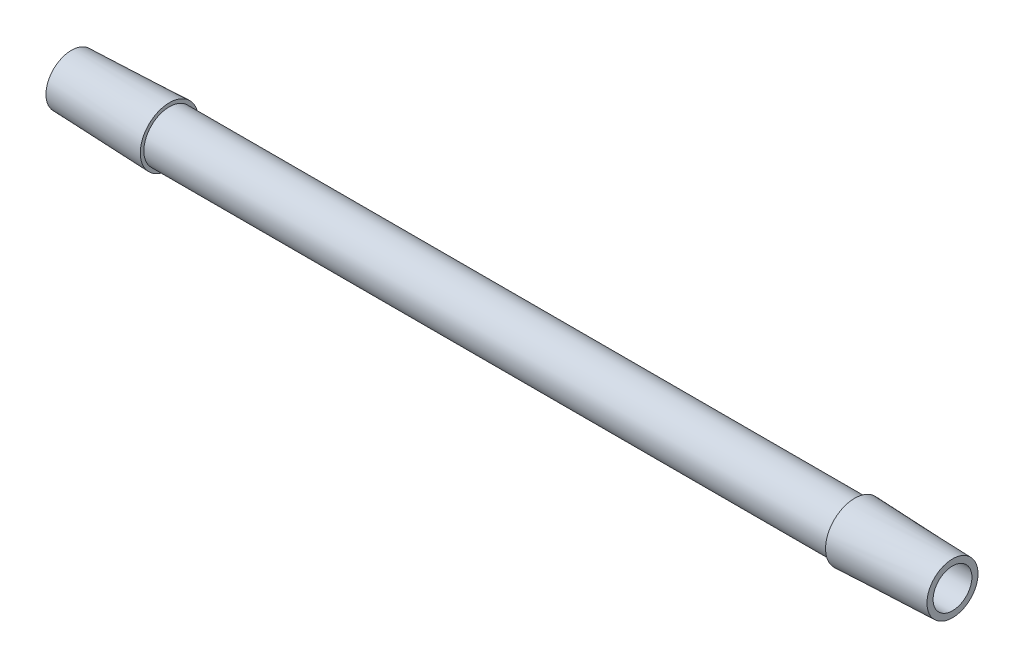
ISO-10303-21;
HEADER;
FILE_DESCRIPTION(('STEP AP214'),'2;1');
FILE_NAME('part.step','',(''),(''),'','','');
FILE_SCHEMA(('AUTOMOTIVE_DESIGN { 1 0 10303 214 1 1 1 1 }'));
ENDSEC;
DATA;
#1=APPLICATION_CONTEXT('core data for automotive mechanical design processes');
#2=APPLICATION_PROTOCOL_DEFINITION('international standard','automotive_design',2000,#1);
#3=PRODUCT_CONTEXT('',#1,'mechanical');
#4=PRODUCT('Part','Part','',(#3));
#5=PRODUCT_RELATED_PRODUCT_CATEGORY('part','',(#4));
#6=PRODUCT_DEFINITION_FORMATION('','',#4);
#7=PRODUCT_DEFINITION_CONTEXT('part definition',#1,'design');
#8=PRODUCT_DEFINITION('design','',#6,#7);
#9=PRODUCT_DEFINITION_SHAPE('','',#8);
#10=(LENGTH_UNIT() NAMED_UNIT(*) SI_UNIT(.MILLI.,.METRE.));
#11=(NAMED_UNIT(*) PLANE_ANGLE_UNIT() SI_UNIT($,.RADIAN.));
#12=(NAMED_UNIT(*) SI_UNIT($,.STERADIAN.) SOLID_ANGLE_UNIT());
#13=UNCERTAINTY_MEASURE_WITH_UNIT(LENGTH_MEASURE(1.E-05),#10,'distance_accuracy_value','');
#14=(GEOMETRIC_REPRESENTATION_CONTEXT(3) GLOBAL_UNCERTAINTY_ASSIGNED_CONTEXT((#13)) GLOBAL_UNIT_ASSIGNED_CONTEXT((#10,
#11,#12)) REPRESENTATION_CONTEXT('',''));
#15=CARTESIAN_POINT('',(0.,0.,0.));
#16=DIRECTION('',(0.,0.,1.));
#17=DIRECTION('',(1.,0.,0.));
#18=AXIS2_PLACEMENT_3D('',#15,#16,#17);
#19=CARTESIAN_POINT('',(72.,0.,0.));
#20=DIRECTION('',(-1.,0.,0.));
#21=DIRECTION('',(0.,0.,1.));
#22=AXIS2_PLACEMENT_3D('',#19,#20,#21);
#23=CYLINDRICAL_SURFACE('',#22,2.085);
#24=CARTESIAN_POINT('',(7.99999999999999,0.,0.));
#25=DIRECTION('',(1.,0.,0.));
#26=DIRECTION('',(0.,0.,-1.));
#27=AXIS2_PLACEMENT_3D('',#24,#25,#26);
#28=CIRCLE('',#27,2.085);
#29=CARTESIAN_POINT('',(7.99999999999999,0.,-2.085));
#30=VERTEX_POINT('',#29);
#31=EDGE_CURVE('E172',#30,#30,#28,.T.);
#32=ORIENTED_EDGE('',*,*,#31,.T.);
#33=EDGE_LOOP('',(#32));
#34=FACE_BOUND('',#33,.T.);
#35=CARTESIAN_POINT('',(64.,0.,0.));
#36=DIRECTION('',(1.,0.,0.));
#37=DIRECTION('',(0.,0.,-1.));
#38=AXIS2_PLACEMENT_3D('',#35,#36,#37);
#39=CIRCLE('',#38,2.085);
#40=CARTESIAN_POINT('',(64.,0.,-2.085));
#41=VERTEX_POINT('',#40);
#42=EDGE_CURVE('E85',#41,#41,#39,.T.);
#43=ORIENTED_EDGE('',*,*,#42,.F.);
#44=EDGE_LOOP('',(#43));
#45=FACE_BOUND('',#44,.T.);
#46=CARTESIAN_POINT('',(36.415,0.,-2.085));
#47=CARTESIAN_POINT('',(36.4149991710071,-0.0385097673049169,-2.08500093848098));
#48=CARTESIAN_POINT('',(36.4145847573027,-0.0770086910896813,-2.08393314795421));
#49=CARTESIAN_POINT('',(36.4129132098612,-0.153919060972507,-2.07966774223883));
#50=CARTESIAN_POINT('',(36.4116550932215,-0.192330352550162,-2.07646764296684));
#51=CARTESIAN_POINT('',(36.407629041223,-0.283221209844286,-2.06635245713016));
#52=CARTESIAN_POINT('',(36.404472110825,-0.33558165602121,-2.05849487817852));
#53=CARTESIAN_POINT('',(36.3963455388832,-0.439419897622538,-2.03885458116174));
#54=CARTESIAN_POINT('',(36.3913757757855,-0.490897633617081,-2.02707159989519));
#55=CARTESIAN_POINT('',(36.3793462743506,-0.592648426975273,-1.99969235312382));
#56=CARTESIAN_POINT('',(36.3722842512539,-0.642920102101451,-1.9840919222012));
#57=CARTESIAN_POINT('',(36.3556552151366,-0.74174179791993,-1.94930500914077));
#58=CARTESIAN_POINT('',(36.3460896404928,-0.790292789077388,-1.93012058793473));
#59=CARTESIAN_POINT('',(36.3212467516915,-0.896259345487727,-1.88361506185062));
#60=CARTESIAN_POINT('',(36.3051599143364,-0.953126203725381,-1.85543839080677));
#61=CARTESIAN_POINT('',(36.2760996691743,-1.03498674205434,-1.81024963404317));
#62=CARTESIAN_POINT('',(36.2655978227798,-1.06168763879829,-1.79470803637047));
#63=CARTESIAN_POINT('',(36.2426095707927,-1.11374784315769,-1.76287266755827));
#64=CARTESIAN_POINT('',(36.2301239268852,-1.13910766072381,-1.74657918680341));
#65=CARTESIAN_POINT('',(36.1981619518951,-1.19651327754359,-1.70796446687377));
#66=CARTESIAN_POINT('',(36.1777478607972,-1.22793129127746,-1.68546272268215));
#67=CARTESIAN_POINT('',(36.1316239803192,-1.28693027549527,-1.64085225379779));
#68=CARTESIAN_POINT('',(36.10592477383,-1.31451873215234,-1.6187428381603));
#69=CARTESIAN_POINT('',(36.0541472281715,-1.35968218319655,-1.58088037723399));
#70=CARTESIAN_POINT('',(36.0291532854659,-1.37815810764345,-1.56473596144591));
#71=CARTESIAN_POINT('',(35.9753787779439,-1.41121864652146,-1.53498617448836));
#72=CARTESIAN_POINT('',(35.9466027235138,-1.42580783434692,-1.52137782493248));
#73=CARTESIAN_POINT('',(35.8859784725503,-1.45080749171398,-1.49755978136518));
#74=CARTESIAN_POINT('',(35.854128638634,-1.46121571867489,-1.48735191180044));
#75=CARTESIAN_POINT('',(35.7884668713754,-1.47805681468094,-1.47061647397089));
#76=CARTESIAN_POINT('',(35.7546523166485,-1.48448423271169,-1.46409395320665));
#77=CARTESIAN_POINT('',(35.6701571684769,-1.49611464717568,-1.45223003661379));
#78=CARTESIAN_POINT('',(35.6189466599822,-1.49935790630689,-1.44884881256993));
#79=CARTESIAN_POINT('',(35.5164149018997,-1.50047253373817,-1.44768657689885));
#80=CARTESIAN_POINT('',(35.4650937839393,-1.49832767639355,-1.44992248055628));
#81=CARTESIAN_POINT('',(35.3636745438276,-1.49012555211944,-1.4583497431017));
#82=CARTESIAN_POINT('',(35.313569294409,-1.48410824094785,-1.46450069966822));
#83=CARTESIAN_POINT('',(35.2142236822196,-1.46904498141503,-1.47960969967835));
#84=CARTESIAN_POINT('',(35.1649842587952,-1.45999593441234,-1.48857061448905));
#85=CARTESIAN_POINT('',(35.0672793869731,-1.43934102336253,-1.5085522073043));
#86=CARTESIAN_POINT('',(35.0188175982459,-1.42772555772792,-1.51958059610212));
#87=CARTESIAN_POINT('',(34.922851261442,-1.40224456913687,-1.54312557433149));
#88=CARTESIAN_POINT('',(34.8753470139677,-1.38837835159512,-1.55564262284584));
#89=CARTESIAN_POINT('',(34.7452090352951,-1.34711493102381,-1.59177008678135));
#90=CARTESIAN_POINT('',(34.6635880147554,-1.31749902015812,-1.61652315274612));
#91=CARTESIAN_POINT('',(34.5034440085413,-1.25190450829697,-1.6678436847954));
#92=CARTESIAN_POINT('',(34.4249243611513,-1.21591926806927,-1.69441302620875));
#93=CARTESIAN_POINT('',(34.2719474924447,-1.13739197251474,-1.74808987582901));
#94=CARTESIAN_POINT('',(34.1974718904573,-1.09488366746099,-1.77519402122993));
#95=CARTESIAN_POINT('',(34.0532461182511,-1.00240753207108,-1.82900763903667));
#96=CARTESIAN_POINT('',(33.9834885906291,-0.952451724418373,-1.85571767266571));
#97=CARTESIAN_POINT('',(33.8665964015209,-0.857014609035718,-1.90126886103836));
#98=CARTESIAN_POINT('',(33.8180830010939,-0.813394969551343,-1.92044517680974));
#99=CARTESIAN_POINT('',(33.7260102557009,-0.720439247161774,-1.95721553520366));
#100=CARTESIAN_POINT('',(33.6824550254764,-0.6710984839048,-1.97480826112178));
#101=CARTESIAN_POINT('',(33.6018091223458,-0.565463444758442,-2.00763008814251));
#102=CARTESIAN_POINT('',(33.5648103125068,-0.509086766507657,-2.02282531702251));
#103=CARTESIAN_POINT('',(33.5011177839023,-0.389914194180464,-2.0491149483013));
#104=CARTESIAN_POINT('',(33.4743893824986,-0.327140826574622,-2.06022314689351));
#105=CARTESIAN_POINT('',(33.441081705179,-0.217582252628833,-2.07409853021049));
#106=CARTESIAN_POINT('',(33.4307901258302,-0.172121393278474,-2.0783979959254));
#107=CARTESIAN_POINT('',(33.4174469850363,-0.0799685156496023,-2.08397520814444));
#108=CARTESIAN_POINT('',(33.4143894120127,-0.0332775522611984,-2.08525546365915));
#109=CARTESIAN_POINT('',(33.415815267174,0.0600025897596786,-2.08465889699805));
#110=CARTESIAN_POINT('',(33.4203047745376,0.106591656041557,-2.08277952974367));
#111=CARTESIAN_POINT('',(33.4363908692695,0.198306773729921,-2.07605888474921));
#112=CARTESIAN_POINT('',(33.4479936416864,0.243431515900241,-2.0712150293661));
#113=CARTESIAN_POINT('',(33.4815433427352,0.343783459453184,-2.0572518238388));
#114=CARTESIAN_POINT('',(33.5054973433689,0.398218634636856,-2.04730682230113));
#115=CARTESIAN_POINT('',(33.5611906696277,0.502201730123208,-2.02431978388004));
#116=CARTESIAN_POINT('',(33.5929444948534,0.551740304493683,-2.01127198045372));
#117=CARTESIAN_POINT('',(33.6818712050029,0.672704739336226,-1.97500785594785));
#118=CARTESIAN_POINT('',(33.7432288535662,0.740552145036615,-1.95022915839704));
#119=CARTESIAN_POINT('',(33.8748820753131,0.865796232613337,-1.89795807225222));
#120=CARTESIAN_POINT('',(33.9452091521725,0.92315425502936,-1.87045619899635));
#121=CARTESIAN_POINT('',(34.0827971246811,1.02236434276414,-1.81789245117699));
#122=CARTESIAN_POINT('',(34.1493655187859,1.06525641654214,-1.79294825458203));
#123=CARTESIAN_POINT('',(34.2861016485374,1.14500484657342,-1.74310111577086));
#124=CARTESIAN_POINT('',(34.3562726833036,1.18185553613449,-1.71819823373037));
#125=CARTESIAN_POINT('',(34.4994118447671,1.24994394338882,-1.66931579699105));
#126=CARTESIAN_POINT('',(34.5723747247574,1.28119161733463,-1.64533466520269));
#127=CARTESIAN_POINT('',(34.7208689653514,1.33833196547614,-1.59919861492766));
#128=CARTESIAN_POINT('',(34.7963981998129,1.36422895238012,-1.57704223440461));
#129=CARTESIAN_POINT('',(34.9368791977315,1.40649249918881,-1.53937085459249));
#130=CARTESIAN_POINT('',(35.0014370350704,1.42373124442249,-1.5233676957969));
#131=CARTESIAN_POINT('',(35.1324616288151,1.45388785526816,-1.494613137929));
#132=CARTESIAN_POINT('',(35.1989317863259,1.46679742995634,-1.48186798933591));
#133=CARTESIAN_POINT('',(35.3003258023161,1.48206242517595,-1.46655059917944));
#134=CARTESIAN_POINT('',(35.3346401004875,1.48648297600255,-1.46206125966427));
#135=CARTESIAN_POINT('',(35.403617085511,1.49362301633155,-1.45476377301681));
#136=CARTESIAN_POINT('',(35.4382799152627,1.49634177656866,-1.45195634665384));
#137=CARTESIAN_POINT('',(35.5423452099914,1.50141185916547,-1.44673448232958));
#138=CARTESIAN_POINT('',(35.6122641496496,1.50075129200625,-1.44744355240469));
#139=CARTESIAN_POINT('',(35.7167932153398,1.49028188106587,-1.45818319559913));
#140=CARTESIAN_POINT('',(35.7523112721166,1.48499508125416,-1.46359787992569));
#141=CARTESIAN_POINT('',(35.8216365010886,1.47031431244713,-1.47834813795108));
#142=CARTESIAN_POINT('',(35.8554466719931,1.46092784266351,-1.48767655134341));
#143=CARTESIAN_POINT('',(35.9203256717508,1.43759051311101,-1.51023793952854));
#144=CARTESIAN_POINT('',(35.9513775033534,1.42361355239399,-1.52349319861261));
#145=CARTESIAN_POINT('',(36.0095132226783,1.39129406189359,-1.55306252445684));
#146=CARTESIAN_POINT('',(36.0365926197697,1.37294665206625,-1.56938000614254));
#147=CARTESIAN_POINT('',(36.0920953509387,1.32799229461299,-1.6077038258507));
#148=CARTESIAN_POINT('',(36.119440375998,1.30045580064034,-1.63016257899447));
#149=CARTESIAN_POINT('',(36.168430387288,1.24117096202827,-1.67574628701054));
#150=CARTESIAN_POINT('',(36.1900604880058,1.20941193592427,-1.69887281094326));
#151=CARTESIAN_POINT('',(36.2250937714186,1.14901713609304,-1.74013384350132));
#152=CARTESIAN_POINT('',(36.2392789848743,1.12090665362698,-1.75839366619925));
#153=CARTESIAN_POINT('',(36.2651668781824,1.06299525204628,-1.79399601770889));
#154=CARTESIAN_POINT('',(36.2768680396299,1.03319331303279,-1.81133798063502));
#155=CARTESIAN_POINT('',(36.2982487487642,0.972154363877724,-1.84481856708735));
#156=CARTESIAN_POINT('',(36.3079246691908,0.940914899071994,-1.86095499880374));
#157=CARTESIAN_POINT('',(36.3255830771722,0.877266986983832,-1.89179261192408));
#158=CARTESIAN_POINT('',(36.3335651121842,0.844858230009237,-1.90649340921536));
#159=CARTESIAN_POINT('',(36.351129472017,0.76537815735329,-1.94009702905434));
#160=CARTESIAN_POINT('',(36.359998074977,0.717811120375887,-1.95820685364457));
#161=CARTESIAN_POINT('',(36.3754364693814,0.621134576577435,-1.99098602880657));
#162=CARTESIAN_POINT('',(36.3820053637145,0.57202447593355,-2.00565403599891));
#163=CARTESIAN_POINT('',(36.3931947009519,0.472738819803948,-2.03134604671662));
#164=CARTESIAN_POINT('',(36.3978186652223,0.422565364142382,-2.04237662803967));
#165=CARTESIAN_POINT('',(36.4053707400758,0.321417044296914,-2.06071856669598));
#166=CARTESIAN_POINT('',(36.4082985116002,0.270442021975023,-2.06802918039506));
#167=CARTESIAN_POINT('',(36.4135082741292,0.146466314565211,-2.08113357249138));
#168=CARTESIAN_POINT('',(36.4150015760552,0.0732135606448902,-2.08499821578943));
#169=CARTESIAN_POINT('',(36.415,0.,-2.085));
#170=B_SPLINE_CURVE_WITH_KNOTS('',3,(#46,#47,#48,#49,#50,#51,#52,#53,#54,#55,#56,#57,#58,#59,
#60,#61,#62,#63,#64,#65,#66,#67,#68,#69,#70,#71,#72,#73,#74,#75,#76,#77,#78,#79,#80,#81,#82,#83,
#84,#85,#86,#87,#88,#89,#90,#91,#92,#93,#94,#95,#96,#97,#98,#99,#100,#101,#102,#103,#104,#105,
#106,#107,#108,#109,#110,#111,#112,#113,#114,#115,#116,#117,#118,#119,#120,#121,#122,#123,#124,
#125,#126,#127,#128,#129,#130,#131,#132,#133,#134,#135,#136,#137,#138,#139,#140,#141,#142,#143,
#144,#145,#146,#147,#148,#149,#150,#151,#152,#153,#154,#155,#156,#157,#158,#159,#160,#161,#162,
#163,#164,#165,#166,#167,#168,#169),.UNSPECIFIED.,.T.,.F.,(4,2,2,2,2,2,2,2,2,2,2,2,2,2,2,2,2,2,
2,2,2,2,2,2,2,2,2,2,2,2,2,2,2,2,2,2,2,2,2,2,2,2,2,2,2,2,2,2,2,2,2,2,2,2,2,2,2,2,2,2,2,4),(0.,
0.115492516845684,0.231119815206893,0.39005342923127,0.548997702028955,0.708116186654227,
0.867143452132375,1.06297266613956,1.16078821092854,1.25856628949253,1.38930377416228,
1.5197819760761,1.62440305044652,1.72890047143349,1.83345386806606,1.93815011738927,
2.09153903034359,2.24539040836335,2.39767926804431,2.55012425461861,2.70314953400564,
2.85622212731333,3.12674517976931,3.39755189754172,3.66700197558921,3.93602169191123,
4.13968141978143,4.34350894952384,4.54999865479806,4.75578479496736,4.89561260209068,
5.03532416912484,5.17514832786077,5.3150942377471,5.4949781643327,5.67519905372808,
5.95793250111927,6.24168786062523,6.49042863234624,6.73940139911041,6.98792727330017,
7.2362520448683,7.44220913511692,7.64855843691185,7.75313881609325,7.85776398029236,
8.06566688691867,8.17422964676634,8.28259464738826,8.39158678472956,8.50070119794201,
8.63446476565365,8.76857338367551,8.8776227245353,8.98673853231664,9.09604812799892,
9.20538689045366,9.36016941391488,9.51501225058939,9.66957351922482,9.82416567305769,
10.0437364203739),.UNSPECIFIED.);
#171=CARTESIAN_POINT('',(36.415,0.,-2.085));
#172=VERTEX_POINT('',#171);
#173=EDGE_CURVE('E80',#172,#172,#170,.T.);
#174=ORIENTED_EDGE('',*,*,#173,.F.);
#175=EDGE_LOOP('',(#174));
#176=FACE_BOUND('',#175,.T.);
#177=ADVANCED_FACE('F39',(#34,#45,#176),#23,.T.);
#178=CARTESIAN_POINT('',(-2.E-05,0.,0.));
#179=DIRECTION('',(1.,0.,0.));
#180=DIRECTION('',(0.,0.,-1.));
#181=AXIS2_PLACEMENT_3D('',#178,#179,#180);
#182=CYLINDRICAL_SURFACE('',#181,1.585);
#183=CARTESIAN_POINT('',(0.,0.,0.));
#184=DIRECTION('',(1.,0.,0.));
#185=DIRECTION('',(0.,0.,-1.));
#186=AXIS2_PLACEMENT_3D('',#183,#184,#185);
#187=CIRCLE('',#186,1.585);
#188=CARTESIAN_POINT('',(0.,0.,-1.585));
#189=VERTEX_POINT('',#188);
#190=EDGE_CURVE('E115',#189,#189,#187,.T.);
#191=ORIENTED_EDGE('',*,*,#190,.F.);
#192=EDGE_LOOP('',(#191));
#193=FACE_BOUND('',#192,.T.);
#194=CARTESIAN_POINT('',(72.,0.,0.));
#195=DIRECTION('',(1.,0.,0.));
#196=DIRECTION('',(0.,0.,-1.));
#197=AXIS2_PLACEMENT_3D('',#194,#195,#196);
#198=CIRCLE('',#197,1.585);
#199=CARTESIAN_POINT('',(72.,0.,-1.585));
#200=VERTEX_POINT('',#199);
#201=EDGE_CURVE('E92',#200,#200,#198,.T.);
#202=ORIENTED_EDGE('',*,*,#201,.T.);
#203=EDGE_LOOP('',(#202));
#204=FACE_BOUND('',#203,.T.);
#205=CARTESIAN_POINT('',(36.8589382981332,-1.22972557914357,-1.));
#206=CARTESIAN_POINT('',(36.8638457151479,-1.20527913127255,-1.03007030546572));
#207=CARTESIAN_POINT('',(36.8681177437656,-1.17967746055384,-1.05929281899992));
#208=CARTESIAN_POINT('',(36.8756819259867,-1.12633744804594,-1.11583826773247));
#209=CARTESIAN_POINT('',(36.8789743825935,-1.09859977032002,-1.14316178832308));
#210=CARTESIAN_POINT('',(36.884872092858,-1.04115500876868,-1.19571603771701));
#211=CARTESIAN_POINT('',(36.8874775575534,-1.01144853325776,-1.22094740757399));
#212=CARTESIAN_POINT('',(36.892159432432,-0.950237393019313,-1.26917072762576));
#213=CARTESIAN_POINT('',(36.8942357746342,-0.918732497869015,-1.29216238983167));
#214=CARTESIAN_POINT('',(36.9002571456509,-0.814829164583991,-1.36224658985243));
#215=CARTESIAN_POINT('',(36.9034129613382,-0.739191880821824,-1.40473562846531));
#216=CARTESIAN_POINT('',(36.9084422036125,-0.582002482114738,-1.47681698438004));
#217=CARTESIAN_POINT('',(36.9103153808216,-0.500449220358339,-1.5064067933337));
#218=CARTESIAN_POINT('',(36.9131403333365,-0.331383371319875,-1.55250794241304));
#219=CARTESIAN_POINT('',(36.914066603436,-0.243770501574113,-1.56865518647478));
#220=CARTESIAN_POINT('',(36.9150631455602,-0.067070943111435,-1.58606787535125));
#221=CARTESIAN_POINT('',(36.9151333380455,0.0220158817828245,-1.58733193734716));
#222=CARTESIAN_POINT('',(36.9144270947569,0.199320015020611,-1.57493156373144));
#223=CARTESIAN_POINT('',(36.9136489790704,0.287535247681867,-1.56123750631281));
#224=CARTESIAN_POINT('',(36.9111183311674,0.46043319445958,-1.51925648152555));
#225=CARTESIAN_POINT('',(36.9093655713185,0.545115078378158,-1.49096610523418));
#226=CARTESIAN_POINT('',(36.9045629247807,0.708529975858363,-1.42060977094538));
#227=CARTESIAN_POINT('',(36.9015125881889,0.78726091491467,-1.37853903611109));
#228=CARTESIAN_POINT('',(36.8934555931215,0.936429794942219,-1.28187265978546));
#229=CARTESIAN_POINT('',(36.8884515787639,1.00687877779066,-1.22729398766504));
#230=CARTESIAN_POINT('',(36.878755779324,1.10045796557712,-1.14136064895233));
#231=CARTESIAN_POINT('',(36.8754885394069,1.12781274053426,-1.1143328414506));
#232=CARTESIAN_POINT('',(36.8680010990825,1.18038751956592,-1.0584790615951));
#233=CARTESIAN_POINT('',(36.8637823764592,1.20561075158549,-1.02965592735236));
#234=CARTESIAN_POINT('',(36.8589382981332,1.22972557914358,-1.));
#235=B_SPLINE_CURVE_WITH_KNOTS('',3,(#205,#206,#207,#208,#209,#210,#211,#212,#213,#214,#215,
#216,#217,#218,#219,#220,#221,#222,#223,#224,#225,#226,#227,#228,#229,#230,#231,#232,#233,#234),
.UNSPECIFIED.,.F.,.F.,(4,2,2,2,2,2,2,2,2,2,2,2,2,2,4),(0.,0.117144406959127,0.234252540789379,
0.351324658012121,0.468411808931296,0.72755761203434,0.986753785452355,1.25276089118189,
1.51879271183616,1.7853523163227,2.05197420313554,2.31868860999959,2.58504328852808,
2.70073077770162,2.8162398106652),.UNSPECIFIED.);
#236=CARTESIAN_POINT('',(36.8589382981332,-1.22972557914357,-1.));
#237=VERTEX_POINT('',#236);
#238=CARTESIAN_POINT('',(36.8589382981332,1.22972557914357,-1.));
#239=VERTEX_POINT('',#238);
#240=EDGE_CURVE('E12',#237,#239,#235,.T.);
#241=ORIENTED_EDGE('',*,*,#240,.F.);
#242=DIRECTION('',(1.,0.,0.));
#243=VECTOR('',#242,1.);
#244=CARTESIAN_POINT('',(-2.E-05,-1.22972557914357,-1.));
#245=LINE('',#244,#243);
#246=CARTESIAN_POINT('',(35.1410617018668,-1.22972557914357,-1.));
#247=VERTEX_POINT('',#246);
#248=EDGE_CURVE('E53',#237,#247,#245,.F.);
#249=ORIENTED_EDGE('',*,*,#248,.T.);
#250=CARTESIAN_POINT('',(35.1410617018668,1.22972557914357,-1.));
#251=CARTESIAN_POINT('',(35.0976281947018,1.21339890546989,-1.0200708106682));
#252=CARTESIAN_POINT('',(35.054475436826,1.19628076726733,-1.04012338756334));
#253=CARTESIAN_POINT('',(34.9686678312803,1.16024454204705,-1.08018048368075));
#254=CARTESIAN_POINT('',(34.9260156379756,1.14131958390995,-1.10018449667509));
#255=CARTESIAN_POINT('',(34.8414272070414,1.10154948347741,-1.14000262634222));
#256=CARTESIAN_POINT('',(34.7994921649639,1.08070144695178,-1.15981640555861));
#257=CARTESIAN_POINT('',(34.7147618269996,1.03597127275165,-1.19997135652614));
#258=CARTESIAN_POINT('',(34.6720082060264,1.01199671359107,-1.22029808690707));
#259=CARTESIAN_POINT('',(34.5878185324338,0.961552952240226,-1.26042795952693));
#260=CARTESIAN_POINT('',(34.5463809529393,0.935086793606281,-1.28023170367662));
#261=CARTESIAN_POINT('',(34.4651437023868,0.879348553382492,-1.3191382914039));
#262=CARTESIAN_POINT('',(34.4253425066408,0.850079172430608,-1.33824178554732));
#263=CARTESIAN_POINT('',(34.3536836458276,0.793011905787301,-1.37269561906664));
#264=CARTESIAN_POINT('',(34.321534785577,0.765660587265883,-1.38817672480281));
#265=CARTESIAN_POINT('',(34.2591597544146,0.708404133184815,-1.4182503988429));
#266=CARTESIAN_POINT('',(34.2289327659108,0.67850009644447,-1.43284334486824));
#267=CARTESIAN_POINT('',(34.1712613633282,0.616189991805477,-1.46071462254612));
#268=CARTESIAN_POINT('',(34.1437906328971,0.583814124493567,-1.47400535146576));
#269=CARTESIAN_POINT('',(34.0920474633821,0.516086412548506,-1.49906020643683));
#270=CARTESIAN_POINT('',(34.0677711367325,0.480738272691215,-1.510826187825));
#271=CARTESIAN_POINT('',(34.0234617100488,0.407062238553865,-1.53231532869271));
#272=CARTESIAN_POINT('',(34.0034115685142,0.368747197807273,-1.54204669115355));
#273=CARTESIAN_POINT('',(33.9686475893697,0.289175858716349,-1.55892690623559));
#274=CARTESIAN_POINT('',(33.9539337438519,0.247919564730701,-1.56607576268375));
#275=CARTESIAN_POINT('',(33.9310203992153,0.162748388177992,-1.57721103597202));
#276=CARTESIAN_POINT('',(33.9228831639246,0.118812235538187,-1.58116722583995));
#277=CARTESIAN_POINT('',(33.91430696242,0.0300224192853443,-1.585336880166));
#278=CARTESIAN_POINT('',(33.9138621335569,-0.0148305195074451,-1.58555319491237));
#279=CARTESIAN_POINT('',(33.9203486679717,-0.0991690338609739,-1.58239945141213));
#280=CARTESIAN_POINT('',(33.9265231702553,-0.13873062608592,-1.57939738562544));
#281=CARTESIAN_POINT('',(33.9444868826311,-0.216232118125535,-1.57066633654152));
#282=CARTESIAN_POINT('',(33.9562794254379,-0.254171040768585,-1.56493573463274));
#283=CARTESIAN_POINT('',(33.9900714931187,-0.342058145012912,-1.54852243370862));
#284=CARTESIAN_POINT('',(34.0142556490786,-0.390960707623333,-1.53678121120994));
#285=CARTESIAN_POINT('',(34.0692597661164,-0.483907948769121,-1.51010324574071));
#286=CARTESIAN_POINT('',(34.1000945193386,-0.52794146193177,-1.49515937998559));
#287=CARTESIAN_POINT('',(34.1608111428502,-0.604249902929513,-1.46576971724172));
#288=CARTESIAN_POINT('',(34.1899656301203,-0.637251810936728,-1.45167028421728));
#289=CARTESIAN_POINT('',(34.2507557406286,-0.700341423976654,-1.4223068096416));
#290=CARTESIAN_POINT('',(34.282393154749,-0.730426989898301,-1.4070419276966));
#291=CARTESIAN_POINT('',(34.3804337917498,-0.8170137151182,-1.35980450991843));
#292=CARTESIAN_POINT('',(34.4497132456787,-0.869546898433131,-1.32651145366553));
#293=CARTESIAN_POINT('',(34.5702469096808,-0.950764523682566,-1.26881669770067));
#294=CARTESIAN_POINT('',(34.6202751728837,-0.981737977868867,-1.24493170610083));
#295=CARTESIAN_POINT('',(34.7220635080512,-1.04022125266003,-1.19649838139327));
#296=CARTESIAN_POINT('',(34.7738246207987,-1.06772894264581,-1.17194965139794));
#297=CARTESIAN_POINT('',(34.8776332330379,-1.11915251705766,-1.12292505925499));
#298=CARTESIAN_POINT('',(34.9296552422861,-1.14312822539137,-1.09845719666211));
#299=CARTESIAN_POINT('',(35.0346673556008,-1.18837110491367,-1.04933490276581));
#300=CARTESIAN_POINT('',(35.087655827466,-1.2096424322893,-1.02468082097856));
#301=CARTESIAN_POINT('',(35.1410617018668,-1.22972557914357,-0.999999999999999));
#302=B_SPLINE_CURVE_WITH_KNOTS('',3,(#250,#251,#252,#253,#254,#255,#256,#257,#258,#259,#260,
#261,#262,#263,#264,#265,#266,#267,#268,#269,#270,#271,#272,#273,#274,#275,#276,#277,#278,#279,
#280,#281,#282,#283,#284,#285,#286,#287,#288,#289,#290,#291,#292,#293,#294,#295,#296,#297,#298,
#299,#300,#301),.UNSPECIFIED.,.F.,.F.,(4,2,2,2,2,2,2,2,2,2,2,2,2,2,2,2,2,2,2,2,2,2,2,2,2,4),(0.,
0.151670493751403,0.303942674569029,0.456447884961056,0.615573070091644,0.774506341062677,
0.933288006375105,1.06806366860818,1.20278160631432,1.33605784169609,1.46917035046502,
1.60173537451802,1.73430020212523,1.86810584572794,2.00180950691949,2.12170805801731,
2.24167782365042,2.40815270138069,2.57500173988628,2.71351711757635,2.85213333824027,
3.13058004240636,3.32099485640974,3.51152616482126,3.69832367562814,3.8848305471183),.UNSPECIFIED.);
#303=CARTESIAN_POINT('',(35.1410617018668,1.22972557914357,-1.));
#304=VERTEX_POINT('',#303);
#305=EDGE_CURVE('E83',#304,#247,#302,.T.);
#306=ORIENTED_EDGE('',*,*,#305,.F.);
#307=DIRECTION('',(1.,0.,0.));
#308=VECTOR('',#307,1.);
#309=CARTESIAN_POINT('',(-2.E-05,1.22972557914357,-1.));
#310=LINE('',#309,#308);
#311=EDGE_CURVE('E78',#304,#239,#310,.T.);
#312=ORIENTED_EDGE('',*,*,#311,.T.);
#313=EDGE_LOOP('',(#241,#249,#306,#312));
#314=FACE_BOUND('',#313,.T.);
#315=ADVANCED_FACE('F82',(#193,#204,#314),#182,.F.);
#316=CARTESIAN_POINT('',(8.,0.,0.));
#317=DIRECTION('',(1.,0.,0.));
#318=DIRECTION('',(0.,0.,-1.));
#319=AXIS2_PLACEMENT_3D('',#316,#317,#318);
#320=PLANE('',#319);
#321=ORIENTED_EDGE('',*,*,#31,.F.);
#322=EDGE_LOOP('',(#321));
#323=FACE_BOUND('',#322,.T.);
#324=CARTESIAN_POINT('',(8.,0.,0.));
#325=DIRECTION('',(1.,0.,0.));
#326=DIRECTION('',(0.,0.,-1.));
#327=AXIS2_PLACEMENT_3D('',#324,#325,#326);
#328=CIRCLE('',#327,2.375);
#329=CARTESIAN_POINT('',(8.,2.36445966593232,0.223507244131472));
#330=VERTEX_POINT('',#329);
#331=EDGE_CURVE('E165',#330,#330,#328,.T.);
#332=ORIENTED_EDGE('',*,*,#331,.T.);
#333=EDGE_LOOP('',(#332));
#334=FACE_BOUND('',#333,.T.);
#335=ADVANCED_FACE('F143',(#323,#334),#320,.T.);
#336=CARTESIAN_POINT('',(8.,2.36445966593232,0.223507244131472));
#337=CARTESIAN_POINT('',(0.,2.07486361964097,-0.205343516796561));
#338=CARTESIAN_POINT('',(8.,2.81147415419526,-4.50541208773316));
#339=CARTESIAN_POINT('',(0.,1.66417658604785,-4.3550707560785));
#340=CARTESIAN_POINT('',(8.,-1.91744517766937,-4.9524265759961));
#341=CARTESIAN_POINT('',(0.,-2.48555065323409,-3.94438372248537));
#342=CARTESIAN_POINT('',(8.,-2.36445966593232,-0.223507244131472));
#343=CARTESIAN_POINT('',(0.,-2.07486361964097,0.205343516796562));
#344=CARTESIAN_POINT('',(8.,-2.81147415419526,4.50541208773316));
#345=CARTESIAN_POINT('',(0.,-1.66417658604784,4.3550707560785));
#346=CARTESIAN_POINT('',(8.,1.91744517766937,4.9524265759961));
#347=CARTESIAN_POINT('',(0.,2.48555065323409,3.94438372248538));
#348=CARTESIAN_POINT('',(8.,2.36445966593232,0.223507244131472));
#349=CARTESIAN_POINT('',(0.,2.07486361964097,-0.205343516796561));
#350=(BOUNDED_SURFACE() B_SPLINE_SURFACE(3,1,((#336,#337),(#338,#339),(#340,#341),(#342,#343),
(#344,#345),(#346,#347),(#348,#349)),.UNSPECIFIED.,.T.,.F.,.F.) B_SPLINE_SURFACE_WITH_KNOTS((4,
3,4),(2,2),(0.,0.5,1.),(0.,1.),
.UNSPECIFIED.) GEOMETRIC_REPRESENTATION_ITEM() RATIONAL_B_SPLINE_SURFACE(((1.,1.),
(0.333333333333333,0.333333333333333),(0.333333333333333,0.333333333333333),(1.,1.),
(0.333333333333333,0.333333333333333),(0.333333333333333,0.333333333333333),(1.,1.))) REPRESENTATION_ITEM('') SURFACE());
#351=CARTESIAN_POINT('',(0.,0.,0.));
#352=DIRECTION('',(-1.,0.,0.));
#353=DIRECTION('',(0.,0.,1.));
#354=AXIS2_PLACEMENT_3D('',#351,#352,#353);
#355=CIRCLE('',#354,2.085);
#356=CARTESIAN_POINT('',(0.,2.07486361964097,-0.205343516796561));
#357=VERTEX_POINT('',#356);
#358=EDGE_CURVE('E177',#357,#357,#355,.F.);
#359=CARTESIAN_POINT('',(8.,2.36445966593232,0.223507244131472));
#360=CARTESIAN_POINT('',(7.91666666666667,2.36144304045011,0.219040048705138));
#361=CARTESIAN_POINT('',(7.83333333333333,2.35842641496791,0.214572853278805));
#362=CARTESIAN_POINT('',(7.66666666666667,2.35239316400351,0.205638462426137));
#363=CARTESIAN_POINT('',(7.58333333333333,2.34937653852131,0.201171266999804));
#364=CARTESIAN_POINT('',(7.41666666666667,2.3433432875569,0.192236876147136));
#365=CARTESIAN_POINT('',(7.33333333333333,2.3403266620747,0.187769680720803));
#366=CARTESIAN_POINT('',(7.16666666666667,2.3342934111103,0.178835289868135));
#367=CARTESIAN_POINT('',(7.08333333333333,2.3312767856281,0.174368094441802));
#368=CARTESIAN_POINT('',(6.91666666666667,2.3252435346637,0.165433703589134));
#369=CARTESIAN_POINT('',(6.83333333333333,2.32222690918149,0.160966508162801));
#370=CARTESIAN_POINT('',(6.66666666666667,2.31619365821709,0.152032117310133));
#371=CARTESIAN_POINT('',(6.58333333333333,2.31317703273489,0.1475649218838));
#372=CARTESIAN_POINT('',(6.41666666666667,2.30714378177049,0.138630531031132));
#373=CARTESIAN_POINT('',(6.33333333333333,2.30412715628828,0.134163335604799));
#374=CARTESIAN_POINT('',(6.16666666666667,2.29809390532388,0.125228944752131));
#375=CARTESIAN_POINT('',(6.08333333333333,2.29507727984168,0.120761749325797));
#376=CARTESIAN_POINT('',(5.91666666666667,2.28904402887728,0.11182735847313));
#377=CARTESIAN_POINT('',(5.83333333333333,2.28602740339508,0.107360163046796));
#378=CARTESIAN_POINT('',(5.66666666666667,2.27999415243067,0.098425772194129));
#379=CARTESIAN_POINT('',(5.58333333333333,2.27697752694847,0.0939585767677954));
#380=CARTESIAN_POINT('',(5.41666666666667,2.27094427598407,0.085024185915128));
#381=CARTESIAN_POINT('',(5.33333333333333,2.26792765050187,0.0805569904887943));
#382=CARTESIAN_POINT('',(5.16666666666667,2.26189439953746,0.0716225996361269));
#383=CARTESIAN_POINT('',(5.08333333333333,2.25887777405526,0.0671554042097933));
#384=CARTESIAN_POINT('',(4.91666666666667,2.25284452309086,0.0582210133571259));
#385=CARTESIAN_POINT('',(4.83333333333333,2.24982789760866,0.0537538179307922));
#386=CARTESIAN_POINT('',(4.66666666666667,2.24379464664425,0.0448194270781248));
#387=CARTESIAN_POINT('',(4.58333333333333,2.24077802116205,0.0403522316517912));
#388=CARTESIAN_POINT('',(4.41666666666667,2.23474477019765,0.0314178407991238));
#389=CARTESIAN_POINT('',(4.33333333333333,2.23172814471545,0.0269506453727901));
#390=CARTESIAN_POINT('',(4.16666666666667,2.22569489375105,0.0180162545201227));
#391=CARTESIAN_POINT('',(4.08333333333333,2.22267826826884,0.0135490590937891));
#392=CARTESIAN_POINT('',(3.91666666666667,2.21664501730444,0.00461466824112168));
#393=CARTESIAN_POINT('',(3.83333333333333,2.21362839182224,0.000147472814788003));
#394=CARTESIAN_POINT('',(3.66666666666667,2.20759514085784,-0.00878691803787936));
#395=CARTESIAN_POINT('',(3.58333333333333,2.20457851537563,-0.013254113464213));
#396=CARTESIAN_POINT('',(3.41666666666667,2.19854526441123,-0.0221885043168804));
#397=CARTESIAN_POINT('',(3.33333333333333,2.19552863892903,-0.0266556997432141));
#398=CARTESIAN_POINT('',(3.16666666666667,2.18949538796463,-0.0355900905958815));
#399=CARTESIAN_POINT('',(3.08333333333333,2.18647876248242,-0.0400572860222151));
#400=CARTESIAN_POINT('',(2.91666666666667,2.18044551151802,-0.0489916768748825));
#401=CARTESIAN_POINT('',(2.83333333333333,2.17742888603582,-0.0534588723012162));
#402=CARTESIAN_POINT('',(2.66666666666667,2.17139563507142,-0.0623932631538836));
#403=CARTESIAN_POINT('',(2.58333333333333,2.16837900958922,-0.0668604585802172));
#404=CARTESIAN_POINT('',(2.41666666666667,2.16234575862481,-0.0757948494328846));
#405=CARTESIAN_POINT('',(2.33333333333333,2.15932913314261,-0.0802620448592183));
#406=CARTESIAN_POINT('',(2.16666666666667,2.15329588217821,-0.0891964357118857));
#407=CARTESIAN_POINT('',(2.08333333333333,2.15027925669601,-0.0936636311382193));
#408=CARTESIAN_POINT('',(1.91666666666667,2.1442460057316,-0.102598021990887));
#409=CARTESIAN_POINT('',(1.83333333333333,2.1412293802494,-0.10706521741722));
#410=CARTESIAN_POINT('',(1.66666666666667,2.135196129285,-0.115999608269888));
#411=CARTESIAN_POINT('',(1.58333333333333,2.1321795038028,-0.120466803696221));
#412=CARTESIAN_POINT('',(1.41666666666667,2.12614625283839,-0.129401194548889));
#413=CARTESIAN_POINT('',(1.33333333333333,2.12312962735619,-0.133868389975222));
#414=CARTESIAN_POINT('',(1.16666666666667,2.11709637639179,-0.14280278082789));
#415=CARTESIAN_POINT('',(1.08333333333333,2.11407975090959,-0.147269976254224));
#416=CARTESIAN_POINT('',(0.916666666666667,2.10804649994519,-0.156204367106891));
#417=CARTESIAN_POINT('',(0.833333333333333,2.10502987446298,-0.160671562533225));
#418=CARTESIAN_POINT('',(0.666666666666667,2.09899662349858,-0.169605953385892));
#419=CARTESIAN_POINT('',(0.583333333333333,2.09597999801638,-0.174073148812226));
#420=CARTESIAN_POINT('',(0.416666666666667,2.08994674705198,-0.183007539664893));
#421=CARTESIAN_POINT('',(0.333333333333333,2.08693012156977,-0.187474735091227));
#422=CARTESIAN_POINT('',(0.166666666666667,2.08089687060537,-0.196409125943894));
#423=CARTESIAN_POINT('',(0.0833333333333334,2.07788024512317,-0.200876321370228));
#424=CARTESIAN_POINT('',(0.,2.07486361964097,-0.205343516796561));
#425=B_SPLINE_CURVE_WITH_KNOTS('',3,(#359,#360,#361,#362,#363,#364,#365,#366,#367,#368,#369,
#370,#371,#372,#373,#374,#375,#376,#377,#378,#379,#380,#381,#382,#383,#384,#385,#386,#387,#388,
#389,#390,#391,#392,#393,#394,#395,#396,#397,#398,#399,#400,#401,#402,#403,#404,#405,#406,#407,
#408,#409,#410,#411,#412,#413,#414,#415,#416,#417,#418,#419,#420,#421,#422,#423,#424),
.UNSPECIFIED.,.F.,.F.,(4,2,2,2,2,2,2,2,2,2,2,2,2,2,2,2,2,2,2,2,2,2,2,2,2,2,2,2,2,2,2,2,4),(0.,
0.250522459628857,0.501044919257715,0.751567378886571,1.00208983851543,1.25261229814429,
1.50313475777314,1.753657217402,2.00417967703086,2.25470213665971,2.50522459628857,
2.75574705591743,3.00626951554628,3.25679197517514,3.507314434804,3.75783689443285,
4.00835935406171,4.25888181369057,4.50940427331943,4.75992673294828,5.01044919257714,
5.260971652206,5.51149411183485,5.76201657146371,6.01253903109257,6.26306149072143,
6.51358395035028,6.76410640997914,7.014628869608,7.26515132923685,7.51567378886571,
7.76619624849457,8.01671870812343),.UNSPECIFIED.);
#426=EDGE_CURVE('BSEAM152',#330,#357,#425,.T.);
#427=ORIENTED_EDGE('',*,*,#331,.F.);
#428=ORIENTED_EDGE('',*,*,#358,.T.);
#429=ORIENTED_EDGE('',*,*,#426,.T.);
#430=ORIENTED_EDGE('',*,*,#426,.F.);
#431=EDGE_LOOP('',(#427,#429,#428,#430));
#432=FACE_BOUND('',#431,.T.);
#433=ADVANCED_FACE('F152',(#432),#350,.T.);
#434=CARTESIAN_POINT('',(0.,0.,0.));
#435=DIRECTION('',(1.,0.,0.));
#436=DIRECTION('',(0.,0.,-1.));
#437=AXIS2_PLACEMENT_3D('',#434,#435,#436);
#438=PLANE('',#437);
#439=ORIENTED_EDGE('',*,*,#190,.T.);
#440=EDGE_LOOP('',(#439));
#441=FACE_BOUND('',#440,.T.);
#442=ORIENTED_EDGE('',*,*,#358,.F.);
#443=EDGE_LOOP('',(#442));
#444=FACE_BOUND('',#443,.T.);
#445=ADVANCED_FACE('F217',(#441,#444),#438,.F.);
#446=CARTESIAN_POINT('',(64.,0.,0.));
#447=DIRECTION('',(1.,0.,0.));
#448=DIRECTION('',(0.,0.,-1.));
#449=AXIS2_PLACEMENT_3D('',#446,#447,#448);
#450=PLANE('',#449);
#451=CARTESIAN_POINT('',(64.,0.,0.));
#452=DIRECTION('',(1.,0.,0.));
#453=DIRECTION('',(0.,0.,-1.));
#454=AXIS2_PLACEMENT_3D('',#451,#452,#453);
#455=CIRCLE('',#454,2.375);
#456=CARTESIAN_POINT('',(64.,2.23459182626629,-0.804502560582567));
#457=VERTEX_POINT('',#456);
#458=EDGE_CURVE('E118',#457,#457,#455,.T.);
#459=ORIENTED_EDGE('',*,*,#458,.F.);
#460=EDGE_LOOP('',(#459));
#461=FACE_BOUND('',#460,.T.);
#462=ORIENTED_EDGE('',*,*,#42,.T.);
#463=EDGE_LOOP('',(#462));
#464=FACE_BOUND('',#463,.T.);
#465=ADVANCED_FACE('F141',(#461,#464),#450,.F.);
#466=CARTESIAN_POINT('',(64.,2.23459182626629,-0.804502560582567));
#467=CARTESIAN_POINT('',(72.,1.71557781598478,-1.18491255259656));
#468=CARTESIAN_POINT('',(64.,3.84359694743142,3.66468109195));
#469=CARTESIAN_POINT('',(72.,4.0854029211779,2.246243079373));
#470=CARTESIAN_POINT('',(64.,-0.625586705101152,5.27368621311514));
#471=CARTESIAN_POINT('',(72.,0.654247289208342,4.61606818456612));
#472=CARTESIAN_POINT('',(64.,-2.23459182626629,0.804502560582567));
#473=CARTESIAN_POINT('',(72.,-1.71557781598478,1.18491255259656));
#474=CARTESIAN_POINT('',(64.,-3.84359694743142,-3.66468109195));
#475=CARTESIAN_POINT('',(72.,-4.0854029211779,-2.246243079373));
#476=CARTESIAN_POINT('',(64.,0.625586705101152,-5.27368621311514));
#477=CARTESIAN_POINT('',(72.,-0.654247289208342,-4.61606818456612));
#478=CARTESIAN_POINT('',(64.,2.23459182626629,-0.804502560582567));
#479=CARTESIAN_POINT('',(72.,1.71557781598478,-1.18491255259656));
#480=(BOUNDED_SURFACE() B_SPLINE_SURFACE(3,1,((#466,#467),(#468,#469),(#470,#471),(#472,#473),
(#474,#475),(#476,#477),(#478,#479)),.UNSPECIFIED.,.T.,.F.,.F.) B_SPLINE_SURFACE_WITH_KNOTS((4,
3,4),(2,2),(0.,0.5,1.),(0.,1.),
.UNSPECIFIED.) GEOMETRIC_REPRESENTATION_ITEM() RATIONAL_B_SPLINE_SURFACE(((1.,1.),
(0.333333333333333,0.333333333333333),(0.333333333333333,0.333333333333333),(1.,1.),
(0.333333333333333,0.333333333333333),(0.333333333333333,0.333333333333333),(1.,1.))) REPRESENTATION_ITEM('') SURFACE());
#481=CARTESIAN_POINT('',(72.,0.,0.));
#482=DIRECTION('',(1.,0.,0.));
#483=DIRECTION('',(0.,0.,-1.));
#484=AXIS2_PLACEMENT_3D('',#481,#482,#483);
#485=CIRCLE('',#484,2.085);
#486=CARTESIAN_POINT('',(72.,1.71557781598478,-1.18491255259656));
#487=VERTEX_POINT('',#486);
#488=EDGE_CURVE('E127',#487,#487,#485,.F.);
#489=CARTESIAN_POINT('',(64.,2.23459182626629,-0.804502560582567));
#490=CARTESIAN_POINT('',(64.0833333333333,2.22918543032585,-0.808465164666046));
#491=CARTESIAN_POINT('',(64.1666666666667,2.22377903438542,-0.812427768749525));
#492=CARTESIAN_POINT('',(64.3333333333333,2.21296624250456,-0.820352976916484));
#493=CARTESIAN_POINT('',(64.4166666666667,2.20755984656412,-0.824315580999963));
#494=CARTESIAN_POINT('',(64.5833333333333,2.19674705468326,-0.832240789166921));
#495=CARTESIAN_POINT('',(64.6666666666667,2.19134065874283,-0.8362033932504));
#496=CARTESIAN_POINT('',(64.8333333333333,2.18052786686196,-0.844128601417358));
#497=CARTESIAN_POINT('',(64.9166666666667,2.17512147092153,-0.848091205500837));
#498=CARTESIAN_POINT('',(65.0833333333333,2.16430867904067,-0.856016413667796));
#499=CARTESIAN_POINT('',(65.1666666666667,2.15890228310023,-0.859979017751275));
#500=CARTESIAN_POINT('',(65.3333333333333,2.14808949121937,-0.867904225918233));
#501=CARTESIAN_POINT('',(65.4166666666667,2.14268309527894,-0.871866830001712));
#502=CARTESIAN_POINT('',(65.5833333333333,2.13187030339807,-0.87979203816867));
#503=CARTESIAN_POINT('',(65.6666666666667,2.12646390745764,-0.883754642252149));
#504=CARTESIAN_POINT('',(65.8333333333333,2.11565111557677,-0.891679850419107));
#505=CARTESIAN_POINT('',(65.9166666666667,2.11024471963634,-0.895642454502586));
#506=CARTESIAN_POINT('',(66.0833333333333,2.09943192775548,-0.903567662669544));
#507=CARTESIAN_POINT('',(66.1666666666667,2.09402553181504,-0.907530266753024));
#508=CARTESIAN_POINT('',(66.3333333333333,2.08321273993418,-0.915455474919982));
#509=CARTESIAN_POINT('',(66.4166666666667,2.07780634399375,-0.919418079003461));
#510=CARTESIAN_POINT('',(66.5833333333333,2.06699355211288,-0.927343287170419));
#511=CARTESIAN_POINT('',(66.6666666666667,2.06158715617245,-0.931305891253898));
#512=CARTESIAN_POINT('',(66.8333333333333,2.05077436429159,-0.939231099420856));
#513=CARTESIAN_POINT('',(66.9166666666667,2.04536796835115,-0.943193703504335));
#514=CARTESIAN_POINT('',(67.0833333333333,2.03455517647029,-0.951118911671293));
#515=CARTESIAN_POINT('',(67.1666666666667,2.02914878052986,-0.955081515754773));
#516=CARTESIAN_POINT('',(67.3333333333333,2.01833598864899,-0.963006723921731));
#517=CARTESIAN_POINT('',(67.4166666666667,2.01292959270856,-0.96696932800521));
#518=CARTESIAN_POINT('',(67.5833333333333,2.00211680082769,-0.974894536172168));
#519=CARTESIAN_POINT('',(67.6666666666667,1.99671040488726,-0.978857140255647));
#520=CARTESIAN_POINT('',(67.8333333333333,1.9858976130064,-0.986782348422605));
#521=CARTESIAN_POINT('',(67.9166666666667,1.98049121706596,-0.990744952506084));
#522=CARTESIAN_POINT('',(68.0833333333333,1.9696784251851,-0.998670160673043));
#523=CARTESIAN_POINT('',(68.1666666666667,1.96427202924467,-1.00263276475652));
#524=CARTESIAN_POINT('',(68.3333333333333,1.9534592373638,-1.01055797292348));
#525=CARTESIAN_POINT('',(68.4166666666667,1.94805284142337,-1.01452057700696));
#526=CARTESIAN_POINT('',(68.5833333333333,1.93724004954251,-1.02244578517392));
#527=CARTESIAN_POINT('',(68.6666666666667,1.93183365360207,-1.0264083892574));
#528=CARTESIAN_POINT('',(68.8333333333333,1.92102086172121,-1.03433359742435));
#529=CARTESIAN_POINT('',(68.9166666666667,1.91561446578078,-1.03829620150783));
#530=CARTESIAN_POINT('',(69.0833333333333,1.90480167389991,-1.04622140967479));
#531=CARTESIAN_POINT('',(69.1666666666667,1.89939527795948,-1.05018401375827));
#532=CARTESIAN_POINT('',(69.3333333333333,1.88858248607861,-1.05810922192523));
#533=CARTESIAN_POINT('',(69.4166666666667,1.88317609013818,-1.06207182600871));
#534=CARTESIAN_POINT('',(69.5833333333333,1.87236329825732,-1.06999703417567));
#535=CARTESIAN_POINT('',(69.6666666666667,1.86695690231689,-1.07395963825915));
#536=CARTESIAN_POINT('',(69.8333333333333,1.85614411043602,-1.0818848464261));
#537=CARTESIAN_POINT('',(69.9166666666667,1.85073771449559,-1.08584745050958));
#538=CARTESIAN_POINT('',(70.0833333333333,1.83992492261472,-1.09377265867654));
#539=CARTESIAN_POINT('',(70.1666666666667,1.83451852667429,-1.09773526276002));
#540=CARTESIAN_POINT('',(70.3333333333333,1.82370573479343,-1.10566047092698));
#541=CARTESIAN_POINT('',(70.4166666666667,1.81829933885299,-1.10962307501046));
#542=CARTESIAN_POINT('',(70.5833333333333,1.80748654697213,-1.11754828317742));
#543=CARTESIAN_POINT('',(70.6666666666667,1.8020801510317,-1.12151088726089));
#544=CARTESIAN_POINT('',(70.8333333333333,1.79126735915083,-1.12943609542785));
#545=CARTESIAN_POINT('',(70.9166666666667,1.7858609632104,-1.13339869951133));
#546=CARTESIAN_POINT('',(71.0833333333333,1.77504817132954,-1.14132390767829));
#547=CARTESIAN_POINT('',(71.1666666666667,1.7696417753891,-1.14528651176177));
#548=CARTESIAN_POINT('',(71.3333333333333,1.75882898350824,-1.15321171992873));
#549=CARTESIAN_POINT('',(71.4166666666667,1.75342258756781,-1.15717432401221));
#550=CARTESIAN_POINT('',(71.5833333333333,1.74260979568694,-1.16509953217916));
#551=CARTESIAN_POINT('',(71.6666666666667,1.73720339974651,-1.16906213626264));
#552=CARTESIAN_POINT('',(71.8333333333333,1.72639060786564,-1.1769873444296));
#553=CARTESIAN_POINT('',(71.9166666666667,1.72098421192521,-1.18094994851308));
#554=CARTESIAN_POINT('',(72.,1.71557781598478,-1.18491255259656));
#555=B_SPLINE_CURVE_WITH_KNOTS('',3,(#489,#490,#491,#492,#493,#494,#495,#496,#497,#498,#499,
#500,#501,#502,#503,#504,#505,#506,#507,#508,#509,#510,#511,#512,#513,#514,#515,#516,#517,#518,
#519,#520,#521,#522,#523,#524,#525,#526,#527,#528,#529,#530,#531,#532,#533,#534,#535,#536,#537,
#538,#539,#540,#541,#542,#543,#544,#545,#546,#547,#548,#549,#550,#551,#552,#553,#554),
.UNSPECIFIED.,.F.,.F.,(4,2,2,2,2,2,2,2,2,2,2,2,2,2,2,2,2,2,2,2,2,2,2,2,2,2,2,2,2,2,2,2,4),(0.,
0.250807460283151,0.501614920566302,0.752422380849452,1.0032298411326,1.25403730141575,
1.5048447616989,1.75565222198206,2.00645968226521,2.25726714254836,2.50807460283151,
2.75888206311466,3.00968952339781,3.26049698368096,3.51130444396411,3.76211190424726,
4.01291936453041,4.26372682481356,4.5145342850967,4.76534174537986,5.01614920566301,
5.26695666594615,5.5177641262293,5.76857158651247,6.0193790467956,6.27018650707875,
6.5209939673619,6.77180142764505,7.02260888792822,7.27341634821135,7.52422380849451,
7.77503126877766,8.02583872906081),.UNSPECIFIED.);
#556=EDGE_CURVE('BSEAM129',#457,#487,#555,.T.);
#557=ORIENTED_EDGE('',*,*,#458,.T.);
#558=ORIENTED_EDGE('',*,*,#488,.T.);
#559=ORIENTED_EDGE('',*,*,#556,.T.);
#560=ORIENTED_EDGE('',*,*,#556,.F.);
#561=EDGE_LOOP('',(#557,#559,#558,#560));
#562=FACE_BOUND('',#561,.T.);
#563=ADVANCED_FACE('F129',(#562),#480,.T.);
#564=CARTESIAN_POINT('',(72.,0.,0.));
#565=DIRECTION('',(1.,0.,0.));
#566=DIRECTION('',(0.,0.,-1.));
#567=AXIS2_PLACEMENT_3D('',#564,#565,#566);
#568=PLANE('',#567);
#569=ORIENTED_EDGE('',*,*,#201,.F.);
#570=EDGE_LOOP('',(#569));
#571=FACE_BOUND('',#570,.T.);
#572=ORIENTED_EDGE('',*,*,#488,.F.);
#573=EDGE_LOOP('',(#572));
#574=FACE_BOUND('',#573,.T.);
#575=ADVANCED_FACE('F140',(#571,#574),#568,.T.);
#576=CARTESIAN_POINT('',(36.,0.,-1.));
#577=DIRECTION('',(0.,0.,1.));
#578=DIRECTION('',(1.,0.,0.));
#579=AXIS2_PLACEMENT_3D('',#576,#577,#578);
#580=PLANE('',#579);
#581=CARTESIAN_POINT('',(36.,0.,-1.));
#582=DIRECTION('',(0.,0.,1.));
#583=DIRECTION('',(1.,0.,0.));
#584=AXIS2_PLACEMENT_3D('',#581,#582,#583);
#585=CIRCLE('',#584,1.5);
#586=EDGE_CURVE('E73',#247,#237,#585,.T.);
#587=ORIENTED_EDGE('',*,*,#586,.F.);
#588=ORIENTED_EDGE('',*,*,#248,.F.);
#589=EDGE_LOOP('',(#587,#588));
#590=FACE_BOUND('',#589,.T.);
#591=ADVANCED_FACE('F101',(#590),#580,.F.);
#592=EDGE_CURVE('E59',#239,#304,#585,.T.);
#593=ORIENTED_EDGE('',*,*,#592,.F.);
#594=ORIENTED_EDGE('',*,*,#311,.F.);
#595=EDGE_LOOP('',(#593,#594));
#596=FACE_BOUND('',#595,.T.);
#597=ADVANCED_FACE('F77',(#596),#580,.F.);
#598=CARTESIAN_POINT('',(37.5,0.,-1.));
#599=CARTESIAN_POINT('',(35.415,0.,-3.085));
#600=CARTESIAN_POINT('',(37.5,3.00000000000001,-1.));
#601=CARTESIAN_POINT('',(35.415,3.00000000000001,-3.085));
#602=CARTESIAN_POINT('',(34.5,3.00000000000001,-1.));
#603=CARTESIAN_POINT('',(32.415,3.00000000000001,-3.085));
#604=CARTESIAN_POINT('',(34.5,0.,-1.));
#605=CARTESIAN_POINT('',(32.415,0.,-3.085));
#606=CARTESIAN_POINT('',(34.5,-3.00000000000001,-1.));
#607=CARTESIAN_POINT('',(32.415,-3.00000000000001,-3.085));
#608=CARTESIAN_POINT('',(37.5,-3.00000000000001,-1.));
#609=CARTESIAN_POINT('',(35.415,-3.00000000000001,-3.085));
#610=CARTESIAN_POINT('',(37.5,0.,-1.));
#611=CARTESIAN_POINT('',(35.415,0.,-3.085));
#612=(BOUNDED_SURFACE() B_SPLINE_SURFACE(3,1,((#598,#599),(#600,#601),(#602,#603),(#604,#605),
(#606,#607),(#608,#609),(#610,#611)),.UNSPECIFIED.,.T.,.F.,.F.) B_SPLINE_SURFACE_WITH_KNOTS((4,
3,4),(2,2),(0.,0.5,1.),(0.,1.),
.UNSPECIFIED.) GEOMETRIC_REPRESENTATION_ITEM() RATIONAL_B_SPLINE_SURFACE(((1.,1.),
(0.333333333333333,0.333333333333333),(0.333333333333333,0.333333333333333),(1.,1.),
(0.333333333333333,0.333333333333333),(0.333333333333333,0.333333333333333),(1.,1.))) REPRESENTATION_ITEM('') SURFACE());
#613=ORIENTED_EDGE('',*,*,#240,.T.);
#614=ORIENTED_EDGE('',*,*,#592,.T.);
#615=ORIENTED_EDGE('',*,*,#305,.T.);
#616=ORIENTED_EDGE('',*,*,#586,.T.);
#617=EDGE_LOOP('',(#613,#614,#615,#616));
#618=FACE_BOUND('',#617,.T.);
#619=ORIENTED_EDGE('',*,*,#173,.T.);
#620=EDGE_LOOP('',(#619));
#621=FACE_BOUND('',#620,.T.);
#622=ADVANCED_FACE('F71',(#618,#621),#612,.T.);
#623=CLOSED_SHELL('',(#177,#315,#335,#433,#445,#465,#563,#575,#591,#597,#622));
#624=MANIFOLD_SOLID_BREP('B2',#623);
#625=ADVANCED_BREP_SHAPE_REPRESENTATION('',(#18,#624),#14);
#626=SHAPE_DEFINITION_REPRESENTATION(#9,#625);
ENDSEC;
END-ISO-10303-21;
